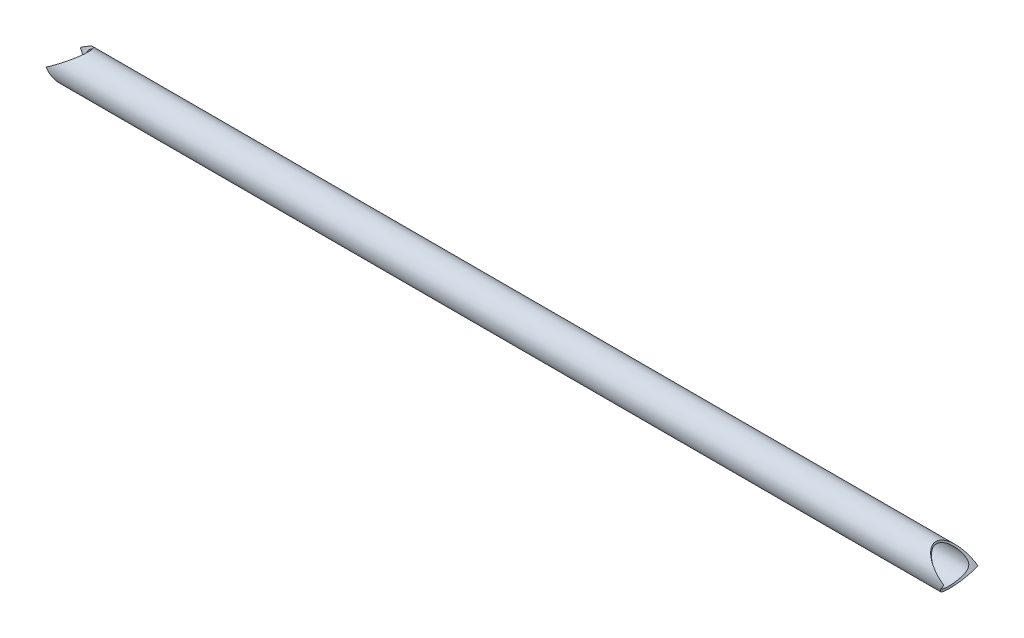
ISO-10303-21;
HEADER;
FILE_DESCRIPTION(('STEP AP214'),'2;1');
FILE_NAME('part.step','',(''),(''),'','','');
FILE_SCHEMA(('AUTOMOTIVE_DESIGN { 1 0 10303 214 1 1 1 1 }'));
ENDSEC;
DATA;
#1=APPLICATION_CONTEXT('core data for automotive mechanical design processes');
#2=APPLICATION_PROTOCOL_DEFINITION('international standard','automotive_design',2000,#1);
#3=PRODUCT_CONTEXT('',#1,'mechanical');
#4=PRODUCT('Part','Part','',(#3));
#5=PRODUCT_RELATED_PRODUCT_CATEGORY('part','',(#4));
#6=PRODUCT_DEFINITION_FORMATION('','',#4);
#7=PRODUCT_DEFINITION_CONTEXT('part definition',#1,'design');
#8=PRODUCT_DEFINITION('design','',#6,#7);
#9=PRODUCT_DEFINITION_SHAPE('','',#8);
#10=(LENGTH_UNIT() NAMED_UNIT(*) SI_UNIT(.MILLI.,.METRE.));
#11=(NAMED_UNIT(*) PLANE_ANGLE_UNIT() SI_UNIT($,.RADIAN.));
#12=(NAMED_UNIT(*) SI_UNIT($,.STERADIAN.) SOLID_ANGLE_UNIT());
#13=UNCERTAINTY_MEASURE_WITH_UNIT(LENGTH_MEASURE(1.E-05),#10,'distance_accuracy_value','');
#14=(GEOMETRIC_REPRESENTATION_CONTEXT(3) GLOBAL_UNCERTAINTY_ASSIGNED_CONTEXT((#13)) GLOBAL_UNIT_ASSIGNED_CONTEXT((#10,
#11,#12)) REPRESENTATION_CONTEXT('',''));
#15=CARTESIAN_POINT('',(0.,0.,0.));
#16=DIRECTION('',(0.,0.,1.));
#17=DIRECTION('',(1.,0.,0.));
#18=AXIS2_PLACEMENT_3D('',#15,#16,#17);
#19=CARTESIAN_POINT('',(333.646874608629,431.8,-139.7));
#20=DIRECTION('',(-1.,0.,0.));
#21=DIRECTION('',(0.,0.,1.));
#22=AXIS2_PLACEMENT_3D('',#19,#20,#21);
#23=CYLINDRICAL_SURFACE('',#22,12.7);
#24=CARTESIAN_POINT('',(333.64687460863,431.8,-139.7));
#25=DIRECTION('',(-0.825585449170687,0.564277118194274,0.));
#26=DIRECTION('',(-0.564277118194274,-0.825585449170687,0.));
#27=AXIS2_PLACEMENT_3D('',#24,#25,#26);
#28=ELLIPSE('',#27,15.383023056859,12.7);
#29=CARTESIAN_POINT('',(333.64687460863,431.8,-127.));
#30=VERTEX_POINT('',#29);
#31=CARTESIAN_POINT('',(333.64687460863,431.8,-152.4));
#32=VERTEX_POINT('',#31);
#33=EDGE_CURVE('E74',#30,#32,#28,.F.);
#34=ORIENTED_EDGE('',*,*,#33,.F.);
#35=CARTESIAN_POINT('',(333.64687460863,431.8,-139.7));
#36=DIRECTION('',(-0.564277118194274,-0.825585449170687,0.));
#37=DIRECTION('',(-0.825585449170687,0.564277118194274,0.));
#38=AXIS2_PLACEMENT_3D('',#35,#36,#37);
#39=ELLIPSE('',#38,22.5066719711068,12.7);
#40=EDGE_CURVE('E76',#32,#30,#39,.F.);
#41=ORIENTED_EDGE('',*,*,#40,.F.);
#42=EDGE_LOOP('',(#34,#41));
#43=FACE_BOUND('',#42,.T.);
#44=CARTESIAN_POINT('',(-333.64687460863,431.8,-139.7));
#45=DIRECTION('',(-0.825585449170687,-0.564277118194274,0.));
#46=DIRECTION('',(-0.564277118194274,0.825585449170688,0.));
#47=AXIS2_PLACEMENT_3D('',#44,#45,#46);
#48=ELLIPSE('',#47,15.383023056859,12.7);
#49=CARTESIAN_POINT('',(-333.64687460863,431.8,-152.4));
#50=VERTEX_POINT('',#49);
#51=CARTESIAN_POINT('',(-333.64687460863,431.8,-127.));
#52=VERTEX_POINT('',#51);
#53=EDGE_CURVE('E80',#50,#52,#48,.T.);
#54=ORIENTED_EDGE('',*,*,#53,.F.);
#55=CARTESIAN_POINT('',(-333.64687460863,431.8,-139.7));
#56=DIRECTION('',(-0.564277118194274,0.825585449170688,0.));
#57=DIRECTION('',(-0.825585449170687,-0.564277118194274,0.));
#58=AXIS2_PLACEMENT_3D('',#55,#56,#57);
#59=ELLIPSE('',#58,22.5066719711068,12.7);
#60=EDGE_CURVE('E66',#52,#50,#59,.T.);
#61=ORIENTED_EDGE('',*,*,#60,.F.);
#62=EDGE_LOOP('',(#54,#61));
#63=FACE_BOUND('',#62,.T.);
#64=ADVANCED_FACE('F43',(#43,#63),#23,.T.);
#65=CARTESIAN_POINT('',(356.781525664989,372.449783946399,-139.7));
#66=DIRECTION('',(-0.363182667764731,0.931717956162321,0.));
#67=DIRECTION('',(-0.931717956162321,-0.363182667764731,0.));
#68=AXIS2_PLACEMENT_3D('',#65,#66,#67);
#69=CYLINDRICAL_SURFACE('',#68,12.7);
#70=CARTESIAN_POINT('',(327.761995444697,431.8,-128.2446));
#71=CARTESIAN_POINT('',(327.816709017865,431.659655215192,-128.244599178284));
#72=CARTESIAN_POINT('',(327.866371149061,431.517358963568,-128.247181091851));
#73=CARTESIAN_POINT('',(327.954597142534,431.229536970124,-128.257907462702));
#74=CARTESIAN_POINT('',(327.993161123709,431.08401126292,-128.26605186039));
#75=CARTESIAN_POINT('',(328.058535350585,430.790856533977,-128.288189768968));
#76=CARTESIAN_POINT('',(328.085351565701,430.643228619904,-128.302180302173));
#77=CARTESIAN_POINT('',(328.127213299122,430.346999601041,-128.336144717678));
#78=CARTESIAN_POINT('',(328.142258478006,430.198398468314,-128.356118772491));
#79=CARTESIAN_POINT('',(328.161052530793,429.902206649609,-128.401907091598));
#80=CARTESIAN_POINT('',(328.164860747625,429.754614777165,-128.427689898695));
#81=CARTESIAN_POINT('',(328.162314299049,429.460617431748,-128.485012173541));
#82=CARTESIAN_POINT('',(328.155955183135,429.314212506529,-128.516554156877));
#83=CARTESIAN_POINT('',(328.123404817266,428.877634922919,-128.619598637074));
#84=CARTESIAN_POINT('',(328.083727002629,428.590384285495,-128.699475441625));
#85=CARTESIAN_POINT('',(327.983904122496,428.055343818723,-128.870644845488));
#86=CARTESIAN_POINT('',(327.926156486918,427.806451926633,-128.960041419548));
#87=CARTESIAN_POINT('',(327.796117721268,427.318548431245,-129.154302901594));
#88=CARTESIAN_POINT('',(327.723815811773,427.07954431029,-129.25917925902));
#89=CARTESIAN_POINT('',(327.569360502046,426.61115867158,-129.483846375951));
#90=CARTESIAN_POINT('',(327.487180525142,426.381805460307,-129.603677405244));
#91=CARTESIAN_POINT('',(327.316834097788,425.933448085234,-129.857434609102));
#92=CARTESIAN_POINT('',(327.228668506653,425.714442443526,-129.991358761921));
#93=CARTESIAN_POINT('',(327.019707999713,425.216621063431,-130.319118830239));
#94=CARTESIAN_POINT('',(326.897696339836,424.941750671386,-130.518197189641));
#95=CARTESIAN_POINT('',(326.653070932126,424.410817220182,-130.939800832542));
#96=CARTESIAN_POINT('',(326.530457031901,424.154759213859,-131.162332376564));
#97=CARTESIAN_POINT('',(326.288563253668,423.662722322566,-131.629932447753));
#98=CARTESIAN_POINT('',(326.169281296213,423.426730717358,-131.874986489585));
#99=CARTESIAN_POINT('',(325.937161625293,422.976154489159,-132.38684983608));
#100=CARTESIAN_POINT('',(325.824323256317,422.761567686972,-132.653656921056));
#101=CARTESIAN_POINT('',(325.608027947904,422.355952327905,-133.207410673493));
#102=CARTESIAN_POINT('',(325.504554720745,422.164882653569,-133.494320773255));
#103=CARTESIAN_POINT('',(325.309223031621,421.807893085663,-134.087184210199));
#104=CARTESIAN_POINT('',(325.217365050795,421.641974233858,-134.393138335457));
#105=CARTESIAN_POINT('',(325.047562922707,421.337571976494,-135.021790695717));
#106=CARTESIAN_POINT('',(324.969607194975,421.199065725787,-135.344474702881));
#107=CARTESIAN_POINT('',(324.829485231056,420.951429646684,-136.00422056458));
#108=CARTESIAN_POINT('',(324.767316143594,420.842294513264,-136.341279809896));
#109=CARTESIAN_POINT('',(324.6671450067,420.667065808271,-136.983327437867));
#110=CARTESIAN_POINT('',(324.627082511877,420.597277250602,-137.286990643148));
#111=CARTESIAN_POINT('',(324.561080504911,420.482523475563,-137.90048264329));
#112=CARTESIAN_POINT('',(324.535139753891,420.437556080668,-138.210310894828));
#113=CARTESIAN_POINT('',(324.497951087894,420.373142674224,-138.833313619193));
#114=CARTESIAN_POINT('',(324.486695145128,420.353682718419,-139.146486169293));
#115=CARTESIAN_POINT('',(324.4790983848,420.340545357635,-139.773545903899));
#116=CARTESIAN_POINT('',(324.482756629381,420.346866331461,-140.08743304223));
#117=CARTESIAN_POINT('',(324.503786923277,420.383253678217,-140.681628976277));
#118=CARTESIAN_POINT('',(324.519743905678,420.410870002268,-140.962142301221));
#119=CARTESIAN_POINT('',(324.563367341634,420.486519968321,-141.519457039151));
#120=CARTESIAN_POINT('',(324.591032788607,420.534551855189,-141.796258769114));
#121=CARTESIAN_POINT('',(324.657593431344,420.650451676539,-142.344278117405));
#122=CARTESIAN_POINT('',(324.696488207261,420.718318869411,-142.615495944101));
#123=CARTESIAN_POINT('',(324.784855597123,420.873120320084,-143.150665198291));
#124=CARTESIAN_POINT('',(324.834328607669,420.960055292783,-143.414616352922));
#125=CARTESIAN_POINT('',(324.943846724174,421.153484601224,-143.937540919769));
#126=CARTESIAN_POINT('',(325.004035963457,421.26024658128,-144.196384939074));
#127=CARTESIAN_POINT('',(325.133511539279,421.491412450287,-144.703690613472));
#128=CARTESIAN_POINT('',(325.202797885962,421.615816358907,-144.952152256991));
#129=CARTESIAN_POINT('',(325.349402008094,421.881202028523,-145.437610567956));
#130=CARTESIAN_POINT('',(325.426720784857,422.022185856642,-145.674605800604));
#131=CARTESIAN_POINT('',(325.588214872666,422.319663321811,-146.136211399648));
#132=CARTESIAN_POINT('',(325.672390895541,422.47615856942,-146.360820476207));
#133=CARTESIAN_POINT('',(325.855680508439,422.821260365776,-146.82036752482));
#134=CARTESIAN_POINT('',(325.955427084094,423.011510359953,-147.053819690049));
#135=CARTESIAN_POINT('',(326.159877273943,423.408580711517,-147.503867661683));
#136=CARTESIAN_POINT('',(326.264581456985,423.61540297234,-147.72046152615));
#137=CARTESIAN_POINT('',(326.476902929958,424.044814183217,-148.136393569433));
#138=CARTESIAN_POINT('',(326.584523267183,424.267420052736,-148.335712705944));
#139=CARTESIAN_POINT('',(326.800020977228,424.727398691978,-148.716296730442));
#140=CARTESIAN_POINT('',(326.90789831359,424.964769474563,-148.89756403943));
#141=CARTESIAN_POINT('',(327.108563192506,425.4257646118,-149.221836111927));
#142=CARTESIAN_POINT('',(327.201662880784,425.647845299436,-149.366845022784));
#143=CARTESIAN_POINT('',(327.382826350158,426.10311867372,-149.641956620498));
#144=CARTESIAN_POINT('',(327.470889151731,426.33631350568,-149.772056412882));
#145=CARTESIAN_POINT('',(327.638171054226,426.813411750936,-150.016580488896));
#146=CARTESIAN_POINT('',(327.717403627052,427.057298038036,-150.131028713768));
#147=CARTESIAN_POINT('',(327.862233439322,427.555815566772,-150.343615517663));
#148=CARTESIAN_POINT('',(327.927839625662,427.81043962515,-150.441764789809));
#149=CARTESIAN_POINT('',(328.049296372012,428.378521737788,-150.63734352829));
#150=CARTESIAN_POINT('',(328.101097485551,428.694150317278,-150.731281451065));
#151=CARTESIAN_POINT('',(328.147387428349,429.175233803893,-150.851867277444));
#152=CARTESIAN_POINT('',(328.157587682867,429.336699494229,-150.888648461123));
#153=CARTESIAN_POINT('',(328.16586923915,429.661425165384,-150.955225981476));
#154=CARTESIAN_POINT('',(328.163951032785,429.82468507311,-150.985022601592));
#155=CARTESIAN_POINT('',(328.146497401829,430.153609922836,-151.037709624586));
#156=CARTESIAN_POINT('',(328.130800930136,430.319280444258,-151.060514031359));
#157=CARTESIAN_POINT('',(328.084782004722,430.649442919451,-151.098684985865));
#158=CARTESIAN_POINT('',(328.054460770139,430.813934970299,-151.114052153362));
#159=CARTESIAN_POINT('',(327.979267077429,431.140177554152,-151.137551971469));
#160=CARTESIAN_POINT('',(327.934386054544,431.301926414405,-151.145680353318));
#161=CARTESIAN_POINT('',(327.831043459018,431.621220446527,-151.15511933753));
#162=CARTESIAN_POINT('',(327.772579391623,431.778764840243,-151.156428686428));
#163=CARTESIAN_POINT('',(327.629818215597,432.121960298588,-151.152421713717));
#164=CARTESIAN_POINT('',(327.542670104361,432.306403793801,-151.145626167173));
#165=CARTESIAN_POINT('',(327.353915623034,432.66720444019,-151.123959685889));
#166=CARTESIAN_POINT('',(327.252303868853,432.843558547622,-151.109085738133));
#167=CARTESIAN_POINT('',(327.037397877456,433.188973082922,-151.072212444201));
#168=CARTESIAN_POINT('',(326.924065414667,433.358006920849,-151.050189248224));
#169=CARTESIAN_POINT('',(326.688592699291,433.688901684527,-150.999834542413));
#170=CARTESIAN_POINT('',(326.566448299655,433.850759174347,-150.971500049108));
#171=CARTESIAN_POINT('',(326.307199464951,434.17853413211,-150.907072682622));
#172=CARTESIAN_POINT('',(326.169639862499,434.34401253573,-150.870590724463));
#173=CARTESIAN_POINT('',(325.888919986936,434.668603165551,-150.791672141643));
#174=CARTESIAN_POINT('',(325.745760367109,434.827716129976,-150.749236210074));
#175=CARTESIAN_POINT('',(325.455149900652,435.14061079517,-150.658698014767));
#176=CARTESIAN_POINT('',(325.307694781809,435.29438683009,-150.610589953964));
#177=CARTESIAN_POINT('',(325.009752478202,435.597145913879,-150.508947492341));
#178=CARTESIAN_POINT('',(324.859264929997,435.74612838261,-150.455412437951));
#179=CARTESIAN_POINT('',(324.40391555333,436.187463094707,-150.286592223485));
#180=CARTESIAN_POINT('',(324.095846714904,436.473486062502,-150.163302289952));
#181=CARTESIAN_POINT('',(323.476694521259,437.031635549512,-149.895674515479));
#182=CARTESIAN_POINT('',(323.165612645314,437.303768513778,-149.751346558424));
#183=CARTESIAN_POINT('',(322.486283722291,437.885483320616,-149.412187939372));
#184=CARTESIAN_POINT('',(322.118142354713,438.192641864271,-149.212955670625));
#185=CARTESIAN_POINT('',(321.387767324149,438.791292905824,-148.78207180148));
#186=CARTESIAN_POINT('',(321.025536285191,439.082778570489,-148.550406216557));
#187=CARTESIAN_POINT('',(320.313560929321,439.648341008598,-148.052906802891));
#188=CARTESIAN_POINT('',(319.963777236714,439.922475311603,-147.78719579491));
#189=CARTESIAN_POINT('',(319.281663957128,440.451998958246,-147.21798826779));
#190=CARTESIAN_POINT('',(318.949320240886,440.707403544879,-146.91452302939));
#191=CARTESIAN_POINT('',(318.287797063997,441.212193042672,-146.244032863971));
#192=CARTESIAN_POINT('',(317.960304469065,441.460042496392,-145.874119927212));
#193=CARTESIAN_POINT('',(317.499874118893,441.806618968837,-145.280871315791));
#194=CARTESIAN_POINT('',(317.351524743974,441.917950299072,-145.076712898116));
#195=CARTESIAN_POINT('',(317.067041828918,442.130940915482,-144.65516034617));
#196=CARTESIAN_POINT('',(316.930907632381,442.232600721388,-144.437766924154));
#197=CARTESIAN_POINT('',(316.693185749917,442.409775701479,-144.02449441837));
#198=CARTESIAN_POINT('',(316.589514221286,442.486900746721,-143.830504941074));
#199=CARTESIAN_POINT('',(316.394142632868,442.632042513829,-143.433326033699));
#200=CARTESIAN_POINT('',(316.30243944398,442.700061616548,-143.230139027084));
#201=CARTESIAN_POINT('',(316.132730586812,442.825797939257,-142.815268369412));
#202=CARTESIAN_POINT('',(316.054710945613,442.88352566926,-142.603593660227));
#203=CARTESIAN_POINT('',(315.91394826837,442.987587177776,-142.172491272892));
#204=CARTESIAN_POINT('',(315.851202395418,443.033923072194,-141.953065043172));
#205=CARTESIAN_POINT('',(315.751237342943,443.107698532315,-141.543439942075));
#206=CARTESIAN_POINT('',(315.711541224441,443.136974536787,-141.354174223097));
#207=CARTESIAN_POINT('',(315.644823989693,443.186161194675,-140.972232989849));
#208=CARTESIAN_POINT('',(315.61780068441,443.206073465537,-140.779558070438));
#209=CARTESIAN_POINT('',(315.577014190473,443.236121855092,-140.392127458666));
#210=CARTESIAN_POINT('',(315.563245484677,443.246262041354,-140.197372666199));
#211=CARTESIAN_POINT('',(315.549259381555,443.256562304062,-139.807105325932));
#212=CARTESIAN_POINT('',(315.549042289583,443.256722155623,-139.611592761157));
#213=CARTESIAN_POINT('',(315.562165603536,443.247057360731,-139.221273651189));
#214=CARTESIAN_POINT('',(315.575506047632,443.237232686164,-139.026467107986));
#215=CARTESIAN_POINT('',(315.61544099913,443.207812131933,-138.638977070188));
#216=CARTESIAN_POINT('',(315.642035246352,443.188216444079,-138.446293533994));
#217=CARTESIAN_POINT('',(315.70792200303,443.139643430117,-138.06421823637));
#218=CARTESIAN_POINT('',(315.747221094701,443.110661240969,-137.874828234992));
#219=CARTESIAN_POINT('',(315.837731010349,443.043866332531,-137.500492574487));
#220=CARTESIAN_POINT('',(315.888944396036,443.00605171416,-137.315547880601));
#221=CARTESIAN_POINT('',(316.017986164691,442.910689137596,-136.900778794778));
#222=CARTESIAN_POINT('',(316.099260390982,442.850574425794,-136.67260871447));
#223=CARTESIAN_POINT('',(316.277617748646,442.718467230038,-136.226163293352));
#224=CARTESIAN_POINT('',(316.374704899713,442.646471725889,-136.007890486544));
#225=CARTESIAN_POINT('',(316.686891870546,442.414579063615,-135.36843091169));
#226=CARTESIAN_POINT('',(316.922810965848,442.238853998784,-134.962928740745));
#227=CARTESIAN_POINT('',(317.369111686753,441.90482929726,-134.294403202968));
#228=CARTESIAN_POINT('',(317.570528266476,441.753616632492,-134.021508640133));
#229=CARTESIAN_POINT('',(317.991106466296,441.436519459187,-133.498620802567));
#230=CARTESIAN_POINT('',(318.210277059948,441.270627527228,-133.248639246723));
#231=CARTESIAN_POINT('',(318.662807156983,440.926321790108,-132.770096488179));
#232=CARTESIAN_POINT('',(318.896195335459,440.747882558799,-132.541581108101));
#233=CARTESIAN_POINT('',(319.373621700015,440.380544992514,-132.105148602834));
#234=CARTESIAN_POINT('',(319.617658834955,440.191647689344,-131.897229451223));
#235=CARTESIAN_POINT('',(320.064644024866,439.842968638241,-131.539964767007));
#236=CARTESIAN_POINT('',(320.266149955893,439.684836200358,-131.387177428348));
#237=CARTESIAN_POINT('',(320.673268946433,439.363000596952,-131.093333958663));
#238=CARTESIAN_POINT('',(320.878882490501,439.199296772577,-130.952279221936));
#239=CARTESIAN_POINT('',(321.293307757483,438.866453552266,-130.681268565915));
#240=CARTESIAN_POINT('',(321.502121781518,438.697310139136,-130.551321121138));
#241=CARTESIAN_POINT('',(321.921809145348,438.353774313663,-130.302167517324));
#242=CARTESIAN_POINT('',(322.132682430464,438.179382040438,-130.182961073937));
#243=CARTESIAN_POINT('',(322.555785537843,437.825001160331,-129.954743265033));
#244=CARTESIAN_POINT('',(322.768016772926,437.645005536631,-129.845745428763));
#245=CARTESIAN_POINT('',(323.192507958988,437.279326096028,-129.637822417994));
#246=CARTESIAN_POINT('',(323.404767909604,437.093642345283,-129.538897126402));
#247=CARTESIAN_POINT('',(323.827927499759,436.716211056475,-129.351016326281));
#248=CARTESIAN_POINT('',(324.038828203648,436.524469204952,-129.262051804649));
#249=CARTESIAN_POINT('',(324.458033844923,436.133907363959,-129.093933117846));
#250=CARTESIAN_POINT('',(324.666338511487,435.935086644219,-129.014779968634));
#251=CARTESIAN_POINT('',(325.071320529281,435.536203718452,-128.869002897367));
#252=CARTESIAN_POINT('',(325.268150960505,435.336421684138,-128.80204060148));
#253=CARTESIAN_POINT('',(325.65523963453,434.927754197643,-128.677797071341));
#254=CARTESIAN_POINT('',(325.845499970118,434.718871693107,-128.620512731291));
#255=CARTESIAN_POINT('',(326.215458423317,434.290970304622,-128.516550200951));
#256=CARTESIAN_POINT('',(326.395198560758,434.071999030124,-128.469827327177));
#257=CARTESIAN_POINT('',(326.740236069444,433.621018115797,-128.387946355875));
#258=CARTESIAN_POINT('',(326.905546494582,433.38902057916,-128.352777724441));
#259=CARTESIAN_POINT('',(327.197771330419,432.936846636753,-128.299142068824));
#260=CARTESIAN_POINT('',(327.326913722095,432.718300003755,-128.279236145489));
#261=CARTESIAN_POINT('',(327.562836767701,432.268357058297,-128.251965485914));
#262=CARTESIAN_POINT('',(327.669616284285,432.036960093045,-128.244601387397));
#263=CARTESIAN_POINT('',(327.761995444697,431.8,-128.2446));
#264=B_SPLINE_CURVE_WITH_KNOTS('',3,(#70,#71,#72,#73,#74,#75,#76,#77,#78,#79,#80,#81,#82,#83,
#84,#85,#86,#87,#88,#89,#90,#91,#92,#93,#94,#95,#96,#97,#98,#99,#100,#101,#102,#103,#104,#105,
#106,#107,#108,#109,#110,#111,#112,#113,#114,#115,#116,#117,#118,#119,#120,#121,#122,#123,#124,
#125,#126,#127,#128,#129,#130,#131,#132,#133,#134,#135,#136,#137,#138,#139,#140,#141,#142,#143,
#144,#145,#146,#147,#148,#149,#150,#151,#152,#153,#154,#155,#156,#157,#158,#159,#160,#161,#162,
#163,#164,#165,#166,#167,#168,#169,#170,#171,#172,#173,#174,#175,#176,#177,#178,#179,#180,#181,
#182,#183,#184,#185,#186,#187,#188,#189,#190,#191,#192,#193,#194,#195,#196,#197,#198,#199,#200,
#201,#202,#203,#204,#205,#206,#207,#208,#209,#210,#211,#212,#213,#214,#215,#216,#217,#218,#219,
#220,#221,#222,#223,#224,#225,#226,#227,#228,#229,#230,#231,#232,#233,#234,#235,#236,#237,#238,
#239,#240,#241,#242,#243,#244,#245,#246,#247,#248,#249,#250,#251,#252,#253,#254,#255,#256,#257,
#258,#259,#260,#261,#262,#263),.UNSPECIFIED.,.T.,.F.,(4,2,2,2,2,2,2,2,2,2,2,2,2,2,2,2,2,2,2,2,2,
2,2,2,2,2,2,2,2,2,2,2,2,2,2,2,2,2,2,2,2,2,2,2,2,2,2,2,2,2,2,2,2,2,2,2,2,2,2,2,2,2,2,2,2,2,2,2,2,
2,2,2,2,2,2,2,2,2,2,2,2,2,2,2,2,2,2,2,2,2,2,2,2,2,2,2,4),(0.,0.451729311858024,0.90345378400409,
1.35494845352557,1.80645614154459,2.25557509034922,2.70489068400834,3.60437893594729,
4.41538077925262,5.22698550464987,6.04082487773956,6.85454765934461,7.9351866026332,
9.01611474253323,10.0963524848805,11.1764801371234,12.2546916215901,13.3329477541704,
14.4103014691073,15.4874604611363,16.4285932980915,17.3696435577217,18.3101791547487,
19.2506556085471,20.096621966461,20.9425156110725,21.7883776331765,22.6342713741895,
23.4925454188367,24.350820420444,25.2092025422498,26.067673883841,27.0184427535641,
27.9693209824354,28.9212343958129,29.8730199718879,30.7156939620757,31.5585312737721,
32.4000645734076,33.2410435750303,34.2375859936469,34.7348418353559,35.2320774943148,
35.7352036528169,36.2382878773681,36.7416685781064,37.2451418063142,37.8564541827125,
38.4679947181259,39.0815966789157,39.6954893191193,40.3499687424884,41.0043720421664,
41.6594500531213,42.3146070485671,43.6279443862636,44.9406666812639,46.4970209108837,
48.054048284595,49.605608922705,51.1558924928588,52.8094901602703,53.636380414398,
54.4632262078344,55.1618847391632,55.8603602399321,56.5581182880524,57.2557466373868,
57.8418870300718,58.4279261384972,59.0137212062645,59.5995294736016,60.1853393903283,
60.7711378076878,61.3572402072932,61.9434687422968,62.6910109988664,63.438743580447,
64.9352499491332,66.048000262917,67.161316555141,68.2769578021916,69.3924891742314,
70.2869340512285,71.1814850722107,72.0767126262517,72.9719164738716,73.8682904081678,
74.7646539211092,75.6601996811717,76.5558380968906,77.4205354596847,78.2849547991508,
79.1456454910097,80.0055493067314,80.7682166015085,81.5309226750952),.UNSPECIFIED.);
#265=CARTESIAN_POINT('',(327.761995444697,431.8,-128.2446));
#266=VERTEX_POINT('',#265);
#267=EDGE_CURVE('E48',#266,#266,#264,.T.);
#268=ORIENTED_EDGE('',*,*,#267,.F.);
#269=EDGE_LOOP('',(#268));
#270=FACE_BOUND('',#269,.T.);
#271=ORIENTED_EDGE('',*,*,#33,.T.);
#272=ORIENTED_EDGE('',*,*,#40,.T.);
#273=EDGE_LOOP('',(#271,#272));
#274=FACE_BOUND('',#273,.T.);
#275=ADVANCED_FACE('F77',(#270,#274),#69,.F.);
#276=CARTESIAN_POINT('',(-76.9133172812,1090.43072922398,-139.7));
#277=DIRECTION('',(-0.363182667764731,-0.931717956162321,0.));
#278=DIRECTION('',(0.931717956162321,-0.363182667764731,0.));
#279=AXIS2_PLACEMENT_3D('',#276,#277,#278);
#280=CYLINDRICAL_SURFACE('',#279,12.7);
#281=CARTESIAN_POINT('',(-327.761995444698,431.8,-128.2446));
#282=CARTESIAN_POINT('',(-327.67020622272,432.035444426666,-128.244601651779));
#283=CARTESIAN_POINT('',(-327.564196787408,432.265409098381,-128.251872172889));
#284=CARTESIAN_POINT('',(-327.329895015944,432.712963838127,-128.278828643224));
#285=CARTESIAN_POINT('',(-327.201573046012,432.930536931906,-128.298531196371));
#286=CARTESIAN_POINT('',(-326.927558293114,433.355376813226,-128.348653011983));
#287=CARTESIAN_POINT('',(-326.78173987592,433.562551796869,-128.379153278137));
#288=CARTESIAN_POINT('',(-326.478294395689,433.966186068069,-128.449409562397));
#289=CARTESIAN_POINT('',(-326.320670818404,434.162648489386,-128.48916285558));
#290=CARTESIAN_POINT('',(-326.002766889503,434.539722644692,-128.575425450165));
#291=CARTESIAN_POINT('',(-325.842778411771,434.720649335722,-128.62164556628));
#292=CARTESIAN_POINT('',(-325.517208699743,435.075386445618,-128.721294401747));
#293=CARTESIAN_POINT('',(-325.351626147269,435.249195165571,-128.774724829131));
#294=CARTESIAN_POINT('',(-325.016443422396,435.5908192846,-128.888510291768));
#295=CARTESIAN_POINT('',(-324.846840176883,435.758629836249,-128.948870768731));
#296=CARTESIAN_POINT('',(-324.504990760515,436.088942735089,-129.076323891202));
#297=CARTESIAN_POINT('',(-324.332744296844,436.25144448784,-129.143417287212));
#298=CARTESIAN_POINT('',(-323.986403146669,436.571940581467,-129.284364791169));
#299=CARTESIAN_POINT('',(-323.812306445657,436.729929126223,-129.35822712156));
#300=CARTESIAN_POINT('',(-323.463277369031,437.041645476031,-129.512675802618));
#301=CARTESIAN_POINT('',(-323.288344925174,437.195372925918,-129.593262711554));
#302=CARTESIAN_POINT('',(-322.763521181605,437.650525575162,-129.845155910602));
#303=CARTESIAN_POINT('',(-322.413378340727,437.946126714543,-130.026685341119));
#304=CARTESIAN_POINT('',(-321.864758298132,438.40074143111,-130.335350577111));
#305=CARTESIAN_POINT('',(-321.664849390795,438.564583279297,-130.452964517568));
#306=CARTESIAN_POINT('',(-321.267226827503,438.887513944638,-130.698085947176));
#307=CARTESIAN_POINT('',(-321.069513232366,439.04660263032,-130.825593709643));
#308=CARTESIAN_POINT('',(-320.677014082938,439.360025587217,-131.091027970337));
#309=CARTESIAN_POINT('',(-320.482230873416,439.514356145053,-131.228962329805));
#310=CARTESIAN_POINT('',(-320.096669860577,439.817878368627,-131.515661545755));
#311=CARTESIAN_POINT('',(-319.905891877678,439.967070264959,-131.664425915314));
#312=CARTESIAN_POINT('',(-319.530468365073,440.259054567008,-131.97242936974));
#313=CARTESIAN_POINT('',(-319.345793205994,440.401879642625,-132.131601194833));
#314=CARTESIAN_POINT('',(-318.982523281124,440.681526227386,-132.461803118611));
#315=CARTESIAN_POINT('',(-318.803929093934,440.818347165596,-132.632834341033));
#316=CARTESIAN_POINT('',(-318.454428643536,441.08504145332,-132.987081413494));
#317=CARTESIAN_POINT('',(-318.283511318903,441.214924853649,-133.170278723558));
#318=CARTESIAN_POINT('',(-317.950658654054,441.467016242159,-133.549647118161));
#319=CARTESIAN_POINT('',(-317.788721732641,441.589225582031,-133.745815905367));
#320=CARTESIAN_POINT('',(-317.498228443524,441.807829243027,-134.122379213487));
#321=CARTESIAN_POINT('',(-317.36822568389,441.905405036098,-134.300969853816));
#322=CARTESIAN_POINT('',(-317.11748553669,442.093205654066,-134.66823734058));
#323=CARTESIAN_POINT('',(-316.996746886987,442.183431480423,-134.856912807102));
#324=CARTESIAN_POINT('',(-316.766000309841,442.355555183765,-135.24450697233));
#325=CARTESIAN_POINT('',(-316.655996418979,442.437449928508,-135.443429481593));
#326=CARTESIAN_POINT('',(-316.448497612954,442.591695737238,-135.851234456075));
#327=CARTESIAN_POINT('',(-316.3509999138,442.664048925363,-136.060114690364));
#328=CARTESIAN_POINT('',(-316.169157695597,442.798830902513,-136.490122524237));
#329=CARTESIAN_POINT('',(-316.084998950018,442.861119722178,-136.711373299403));
#330=CARTESIAN_POINT('',(-315.933381206632,442.973231765473,-137.162473371746));
#331=CARTESIAN_POINT('',(-315.865911611072,443.023062900057,-137.392317105012));
#332=CARTESIAN_POINT('',(-315.749523321459,443.108967304115,-137.85890335965));
#333=CARTESIAN_POINT('',(-315.700582382065,443.145057071654,-138.095637238511));
#334=CARTESIAN_POINT('',(-315.622677655346,443.202483363347,-138.57413185268));
#335=CARTESIAN_POINT('',(-315.593709966782,443.22382276859,-138.815891596812));
#336=CARTESIAN_POINT('',(-315.559129192163,443.249294287185,-139.270234258634));
#337=CARTESIAN_POINT('',(-315.550968534432,443.255303469481,-139.482522236135));
#338=CARTESIAN_POINT('',(-315.550709605723,443.255494181936,-139.907103824044));
#339=CARTESIAN_POINT('',(-315.558609864756,443.249676794532,-140.119397432158));
#340=CARTESIAN_POINT('',(-315.590261547979,443.226362825829,-140.542176177319));
#341=CARTESIAN_POINT('',(-315.614015692947,443.208864239852,-140.752660997669));
#342=CARTESIAN_POINT('',(-315.676758499351,443.162620915389,-141.170079667749));
#343=CARTESIAN_POINT('',(-315.715747236876,443.133876120735,-141.37701349974));
#344=CARTESIAN_POINT('',(-315.803987557452,443.06877383543,-141.768022694626));
#345=CARTESIAN_POINT('',(-315.852047241808,443.033299123365,-141.9525174252));
#346=CARTESIAN_POINT('',(-315.959201841421,442.954140092596,-142.316499108768));
#347=CARTESIAN_POINT('',(-316.018299962385,442.910453389,-142.495984589561));
#348=CARTESIAN_POINT('',(-316.21069612007,442.768091333392,-143.025771960924));
#349=CARTESIAN_POINT('',(-316.359140624785,442.658081153764,-143.367595905471));
#350=CARTESIAN_POINT('',(-316.785723466094,442.341070076752,-144.219226203089));
#351=CARTESIAN_POINT('',(-317.088770985656,442.115093475153,-144.709482038344));
#352=CARTESIAN_POINT('',(-317.584909855513,441.742714365272,-145.395322484518));
#353=CARTESIAN_POINT('',(-317.75751194668,441.612795633579,-145.615976659532));
#354=CARTESIAN_POINT('',(-318.114258857653,441.343273681145,-146.041565399735));
#355=CARTESIAN_POINT('',(-318.29840311324,441.203670933754,-146.246500732226));
#356=CARTESIAN_POINT('',(-318.788139368135,440.830775585698,-146.758539482472));
#357=CARTESIAN_POINT('',(-319.100933794695,440.591061994626,-147.054073281418));
#358=CARTESIAN_POINT('',(-319.743407983533,440.094194743062,-147.610223587386));
#359=CARTESIAN_POINT('',(-320.073099306007,439.837029102493,-147.870815735731));
#360=CARTESIAN_POINT('',(-320.745368405163,439.306353973555,-148.360940019184));
#361=CARTESIAN_POINT('',(-321.087998035294,439.032775380174,-148.590325282375));
#362=CARTESIAN_POINT('',(-321.779970029097,438.471361207778,-149.019005906991));
#363=CARTESIAN_POINT('',(-322.129309381708,438.183531936456,-149.218314425745));
#364=CARTESIAN_POINT('',(-322.668021073925,437.729803020585,-149.502987638583));
#365=CARTESIAN_POINT('',(-322.8565820515,437.56914151673,-149.598387695112));
#366=CARTESIAN_POINT('',(-323.233631892424,437.243289840152,-149.781255437488));
#367=CARTESIAN_POINT('',(-323.422120759435,437.078099940991,-149.868723601137));
#368=CARTESIAN_POINT('',(-323.798432590647,436.742581387565,-150.03596927353));
#369=CARTESIAN_POINT('',(-323.986254336778,436.572246194979,-150.115736405758));
#370=CARTESIAN_POINT('',(-324.35996104645,436.226078257207,-150.267485079844));
#371=CARTESIAN_POINT('',(-324.545846101836,436.05024577432,-150.339466992437));
#372=CARTESIAN_POINT('',(-324.913295956466,435.693374698451,-150.475158932519));
#373=CARTESIAN_POINT('',(-325.094880190889,435.512374399734,-150.538916734294));
#374=CARTESIAN_POINT('',(-325.453306579095,435.14306650988,-150.658457195266));
#375=CARTESIAN_POINT('',(-325.630147671135,434.954757305364,-150.714238080752));
#376=CARTESIAN_POINT('',(-325.976435359164,434.569972124991,-150.817240359804));
#377=CARTESIAN_POINT('',(-326.14589795862,434.373515835046,-150.86448105886));
#378=CARTESIAN_POINT('',(-326.474731856248,433.970505217434,-150.949778261655));
#379=CARTESIAN_POINT('',(-326.63410952889,433.76395741773,-150.987840610483));
#380=CARTESIAN_POINT('',(-326.894097415305,433.401024766364,-151.043987230111));
#381=CARTESIAN_POINT('',(-326.998277271074,433.247606050174,-151.064659667715));
#382=CARTESIAN_POINT('',(-327.197511571216,432.934228887169,-151.10020108294));
#383=CARTESIAN_POINT('',(-327.292565371261,432.774269979732,-151.115069651017));
#384=CARTESIAN_POINT('',(-327.470849718253,432.448227545189,-151.138207114928));
#385=CARTESIAN_POINT('',(-327.554127010998,432.282171729296,-151.146502742245));
#386=CARTESIAN_POINT('',(-327.706800421934,431.943579587435,-151.155750246413));
#387=CARTESIAN_POINT('',(-327.77620128421,431.771045500307,-151.156704637289));
#388=CARTESIAN_POINT('',(-327.887129187264,431.453982053148,-151.151051117592));
#389=CARTESIAN_POINT('',(-327.931448518098,431.310403700327,-151.145853869985));
#390=CARTESIAN_POINT('',(-328.008672927499,431.020524311794,-151.129770994383));
#391=CARTESIAN_POINT('',(-328.04157970469,430.874223684678,-151.118886213515));
#392=CARTESIAN_POINT('',(-328.095639983704,430.579932466897,-151.091201704349));
#393=CARTESIAN_POINT('',(-328.116786721995,430.43194095358,-151.074398581299));
#394=CARTESIAN_POINT('',(-328.147536544902,430.135548062167,-151.034820554901));
#395=CARTESIAN_POINT('',(-328.157137289496,429.987146607094,-151.012044442148));
#396=CARTESIAN_POINT('',(-328.166506542367,429.656906036181,-150.954666216734));
#397=CARTESIAN_POINT('',(-328.163495910043,429.475250823079,-150.918548059506));
#398=CARTESIAN_POINT('',(-328.143238582609,429.114678719295,-150.837747489501));
#399=CARTESIAN_POINT('',(-328.125987434721,428.935762702939,-150.793062401339));
#400=CARTESIAN_POINT('',(-328.079618991017,428.581225312567,-150.695435107032));
#401=CARTESIAN_POINT('',(-328.050466357287,428.405615393643,-150.642468603198));
#402=CARTESIAN_POINT('',(-327.982634437578,428.058775600753,-150.528793206265));
#403=CARTESIAN_POINT('',(-327.943951453563,427.887547455573,-150.468081312161));
#404=CARTESIAN_POINT('',(-327.831748032614,427.440553822049,-150.297641470869));
#405=CARTESIAN_POINT('',(-327.751874025202,427.168778122218,-150.181601509753));
#406=CARTESIAN_POINT('',(-327.579381305856,426.638214174711,-149.930756078666));
#407=CARTESIAN_POINT('',(-327.486754512387,426.379434305645,-149.795938708676));
#408=CARTESIAN_POINT('',(-327.294002284424,425.874763396212,-149.508270063891));
#409=CARTESIAN_POINT('',(-327.193871020028,425.628882634031,-149.355404714231));
#410=CARTESIAN_POINT('',(-326.990125029377,425.150422163118,-149.032342154771));
#411=CARTESIAN_POINT('',(-326.886511020603,424.917839741135,-148.8621485003));
#412=CARTESIAN_POINT('',(-326.672358712678,424.45231731428,-148.493815451447));
#413=CARTESIAN_POINT('',(-326.561788142606,424.220243129425,-148.294599110711));
#414=CARTESIAN_POINT('',(-326.342950674905,423.772171929651,-147.877641316658));
#415=CARTESIAN_POINT('',(-326.234683918347,423.556175897247,-147.659898732964));
#416=CARTESIAN_POINT('',(-326.022885529461,423.14136818937,-147.206572770002));
#417=CARTESIAN_POINT('',(-325.919352611208,422.942551833904,-146.97099428251));
#418=CARTESIAN_POINT('',(-325.719094892736,422.563331514234,-146.482748963736));
#419=CARTESIAN_POINT('',(-325.622369687971,422.382926455658,-146.230083149615));
#420=CARTESIAN_POINT('',(-325.429378501706,422.026780570289,-145.68543424591));
#421=CARTESIAN_POINT('',(-325.333919150874,421.852883015223,-145.391953156643));
#422=CARTESIAN_POINT('',(-325.155513470648,421.530637331588,-144.787597254703));
#423=CARTESIAN_POINT('',(-325.07256821251,421.382291390184,-144.47672095605));
#424=CARTESIAN_POINT('',(-324.921225288998,421.113281356647,-143.839999686095));
#425=CARTESIAN_POINT('',(-324.852819237649,420.992601304109,-143.514163476036));
#426=CARTESIAN_POINT('',(-324.732216140959,420.780737498898,-142.850146802395));
#427=CARTESIAN_POINT('',(-324.680016002067,420.689548116603,-142.511968708549));
#428=CARTESIAN_POINT('',(-324.598875773365,420.548175128271,-141.871548578315));
#429=CARTESIAN_POINT('',(-324.567782154971,420.494180614969,-141.570414895604));
#430=CARTESIAN_POINT('',(-324.519475272697,420.410399869037,-140.963702147307));
#431=CARTESIAN_POINT('',(-324.502260726766,420.380611400422,-140.658123494972));
#432=CARTESIAN_POINT('',(-324.482077024317,420.345692386751,-140.045248370663));
#433=CARTESIAN_POINT('',(-324.479100682963,420.340549405172,-139.737952843449));
#434=CARTESIAN_POINT('',(-324.487437258895,420.354966000587,-139.124141855067));
#435=CARTESIAN_POINT('',(-324.498749571947,420.374524533012,-138.817626361462));
#436=CARTESIAN_POINT('',(-324.533842792094,420.435310750175,-138.234217457024));
#437=CARTESIAN_POINT('',(-324.556468621197,420.47453177329,-137.957042115419));
#438=CARTESIAN_POINT('',(-324.613059172276,420.572876569146,-137.407444761265));
#439=CARTESIAN_POINT('',(-324.647023045636,420.631998852347,-137.135022394578));
#440=CARTESIAN_POINT('',(-324.725717490773,420.76946226622,-136.596677315276));
#441=CARTESIAN_POINT('',(-324.770447946245,420.847803189287,-136.330754532484));
#442=CARTESIAN_POINT('',(-324.869948000594,421.022861626429,-135.806962831196));
#443=CARTESIAN_POINT('',(-324.924718024447,421.119579918427,-135.549094254175));
#444=CARTESIAN_POINT('',(-325.045245275311,421.333649983281,-135.035071078813));
#445=CARTESIAN_POINT('',(-325.111286191057,421.451540197281,-134.77920756565));
#446=CARTESIAN_POINT('',(-325.252053259994,421.704713594659,-134.278742462472));
#447=CARTESIAN_POINT('',(-325.326779530125,421.839997012221,-134.034141024152));
#448=CARTESIAN_POINT('',(-325.48377314906,422.126884894349,-133.557157498433));
#449=CARTESIAN_POINT('',(-325.566042612122,422.278493936862,-133.324778865822));
#450=CARTESIAN_POINT('',(-325.736842110748,422.596943411759,-132.873118644109));
#451=CARTESIAN_POINT('',(-325.825372797784,422.76378542964,-132.653838422269));
#452=CARTESIAN_POINT('',(-326.017910161265,423.131976455836,-132.204300214332));
#453=CARTESIAN_POINT('',(-326.122518569978,423.335081394887,-131.975736794224));
#454=CARTESIAN_POINT('',(-326.335691309758,423.757877420803,-131.536458197312));
#455=CARTESIAN_POINT('',(-326.444256218609,423.977570935228,-131.325745642405));
#456=CARTESIAN_POINT('',(-326.662933543041,424.432755377726,-130.92261974182));
#457=CARTESIAN_POINT('',(-326.77304707088,424.668258172185,-130.730220409894));
#458=CARTESIAN_POINT('',(-326.991720629682,425.154230541009,-130.364454152111));
#459=CARTESIAN_POINT('',(-327.100280988225,425.404696899941,-130.191083159922));
#460=CARTESIAN_POINT('',(-327.288617912365,425.863395467881,-129.900023846323));
#461=CARTESIAN_POINT('',(-327.369461607116,426.068757334198,-129.778488431886));
#462=CARTESIAN_POINT('',(-327.525474051414,426.488392858452,-129.547642365261));
#463=CARTESIAN_POINT('',(-327.600642229214,426.702667410882,-129.438332944176));
#464=CARTESIAN_POINT('',(-327.742102895411,427.139745511459,-129.232599272386));
#465=CARTESIAN_POINT('',(-327.808408962286,427.362535323007,-129.136155309741));
#466=CARTESIAN_POINT('',(-327.928266475666,427.816768756988,-128.956647855959));
#467=CARTESIAN_POINT('',(-327.981824411202,428.048207907037,-128.873577564379));
#468=CARTESIAN_POINT('',(-328.05551455581,428.436904675288,-128.748209108966));
#469=CARTESIAN_POINT('',(-328.080789092155,428.591865636033,-128.701798826133));
#470=CARTESIAN_POINT('',(-328.122137380603,428.904741888021,-128.61532643035));
#471=CARTESIAN_POINT('',(-328.138214311947,429.062656138915,-128.575262127319));
#472=CARTESIAN_POINT('',(-328.159476213193,429.38043015299,-128.501857283589));
#473=CARTESIAN_POINT('',(-328.164685005817,429.540284886808,-128.468502181906));
#474=CARTESIAN_POINT('',(-328.162739440591,429.861215965203,-128.408679132325));
#475=CARTESIAN_POINT('',(-328.155587450432,430.022292069944,-128.38220986657));
#476=CARTESIAN_POINT('',(-328.129850154652,430.32071083663,-128.339666562853));
#477=CARTESIAN_POINT('',(-328.113091774194,430.458076084196,-128.322638017473));
#478=CARTESIAN_POINT('',(-328.069462061999,430.731769978764,-128.293685487285));
#479=CARTESIAN_POINT('',(-328.042588762956,430.868098418845,-128.28176249645));
#480=CARTESIAN_POINT('',(-327.978867015048,431.13868626142,-128.262900674127));
#481=CARTESIAN_POINT('',(-327.942022980307,431.272946551766,-128.255959642041));
#482=CARTESIAN_POINT('',(-327.858894235519,431.538693826069,-128.246808085037));
#483=CARTESIAN_POINT('',(-327.812606479103,431.670179899974,-128.244599089237));
#484=CARTESIAN_POINT('',(-327.761995444698,431.8,-128.2446));
#485=B_SPLINE_CURVE_WITH_KNOTS('',3,(#281,#282,#283,#284,#285,#286,#287,#288,#289,#290,#291,
#292,#293,#294,#295,#296,#297,#298,#299,#300,#301,#302,#303,#304,#305,#306,#307,#308,#309,#310,
#311,#312,#313,#314,#315,#316,#317,#318,#319,#320,#321,#322,#323,#324,#325,#326,#327,#328,#329,
#330,#331,#332,#333,#334,#335,#336,#337,#338,#339,#340,#341,#342,#343,#344,#345,#346,#347,#348,
#349,#350,#351,#352,#353,#354,#355,#356,#357,#358,#359,#360,#361,#362,#363,#364,#365,#366,#367,
#368,#369,#370,#371,#372,#373,#374,#375,#376,#377,#378,#379,#380,#381,#382,#383,#384,#385,#386,
#387,#388,#389,#390,#391,#392,#393,#394,#395,#396,#397,#398,#399,#400,#401,#402,#403,#404,#405,
#406,#407,#408,#409,#410,#411,#412,#413,#414,#415,#416,#417,#418,#419,#420,#421,#422,#423,#424,
#425,#426,#427,#428,#429,#430,#431,#432,#433,#434,#435,#436,#437,#438,#439,#440,#441,#442,#443,
#444,#445,#446,#447,#448,#449,#450,#451,#452,#453,#454,#455,#456,#457,#458,#459,#460,#461,#462,
#463,#464,#465,#466,#467,#468,#469,#470,#471,#472,#473,#474,#475,#476,#477,#478,#479,#480,#481,
#482,#483,#484),.UNSPECIFIED.,.T.,.F.,(4,2,2,2,2,2,2,2,2,2,2,2,2,2,2,2,2,2,2,2,2,2,2,2,2,2,2,2,
2,2,2,2,2,2,2,2,2,2,2,2,2,2,2,2,2,2,2,2,2,2,2,2,2,2,2,2,2,2,2,2,2,2,2,2,2,2,2,2,2,2,2,2,2,2,2,2,
2,2,2,2,2,2,2,2,2,2,2,2,2,2,2,2,2,2,2,2,2,2,2,2,2,4),(0.,0.757856061082655,1.51672644509385,
2.28141485878604,3.04587836366138,3.78326345857884,4.52082353833471,5.25896678809773,
5.99719240828767,6.73632697201644,7.47552295918534,8.95296225418431,9.8047081873164,
10.6564776581935,11.5088958607634,12.3612757616968,13.208607079504,14.0560187962143,
14.9021675241429,15.7481667930012,16.4721840270731,17.1961024456979,17.920292038241,
18.6443201388207,19.3776823262788,20.1105776199801,20.842590194425,21.5744597493193,
22.2111387408481,22.8477594624017,23.4844894662081,24.1212226501755,24.7024135039036,
25.2837734061376,26.4459020992933,28.2920600959956,29.2179619461195,30.1438185703516,
31.6192990034125,33.0958027406647,34.5790313688294,36.061609253238,36.8578573018784,
37.6540573542134,38.4513156714951,39.2485360060791,40.0408939183689,40.8334277428017,
41.6241469726046,42.4143613072717,42.9738036235396,43.5332854091961,44.0904799900555,
44.6474837498157,45.0980161722643,45.5484815094784,45.9992056549214,46.4500211330449,
47.0048355742211,47.5598235626104,48.1164715481885,48.6733358696318,49.5902428982054,
50.5077336751367,51.425944750623,52.3439678107153,53.3187127478971,54.2935172017122,
55.2680552619968,56.2425353617564,57.3037221057672,58.3649996400507,59.4256633757241,
60.4861245163341,61.4074138789654,62.3286181296235,63.2493574762331,64.1700578882164,
65.0116347214588,65.8531485795993,66.6946533478844,67.5361937454121,68.4033492937023,
69.2705165187938,70.1379275467973,71.0054289607663,71.9739369507376,72.942586947232,
73.9119723188687,74.8811501290925,75.6365498721286,76.3920256123078,77.1463302120698,
77.9002500320446,78.391082109846,78.8817444241035,79.3713300824919,79.8608219717828,
80.2786595051419,80.6965783480657,81.114312476815,81.5321815725004),.UNSPECIFIED.);
#486=CARTESIAN_POINT('',(-327.761995444698,431.8,-128.2446));
#487=VERTEX_POINT('',#486);
#488=EDGE_CURVE('E11',#487,#487,#485,.T.);
#489=ORIENTED_EDGE('',*,*,#488,.F.);
#490=EDGE_LOOP('',(#489));
#491=FACE_BOUND('',#490,.T.);
#492=ORIENTED_EDGE('',*,*,#53,.T.);
#493=ORIENTED_EDGE('',*,*,#60,.T.);
#494=EDGE_LOOP('',(#492,#493));
#495=FACE_BOUND('',#494,.T.);
#496=ADVANCED_FACE('F45',(#491,#495),#280,.F.);
#497=CARTESIAN_POINT('',(333.646874608629,431.8,-139.7));
#498=DIRECTION('',(-1.,0.,0.));
#499=DIRECTION('',(0.,0.,1.));
#500=AXIS2_PLACEMENT_3D('',#497,#498,#499);
#501=CYLINDRICAL_SURFACE('',#500,11.4554);
#502=ORIENTED_EDGE('',*,*,#267,.T.);
#503=EDGE_LOOP('',(#502));
#504=FACE_BOUND('',#503,.T.);
#505=ORIENTED_EDGE('',*,*,#488,.T.);
#506=EDGE_LOOP('',(#505));
#507=FACE_BOUND('',#506,.T.);
#508=ADVANCED_FACE('F92',(#504,#507),#501,.F.);
#509=CLOSED_SHELL('',(#64,#275,#496,#508));
#510=MANIFOLD_SOLID_BREP('B2',#509);
#511=ADVANCED_BREP_SHAPE_REPRESENTATION('',(#18,#510),#14);
#512=SHAPE_DEFINITION_REPRESENTATION(#9,#511);
ENDSEC;
END-ISO-10303-21;
